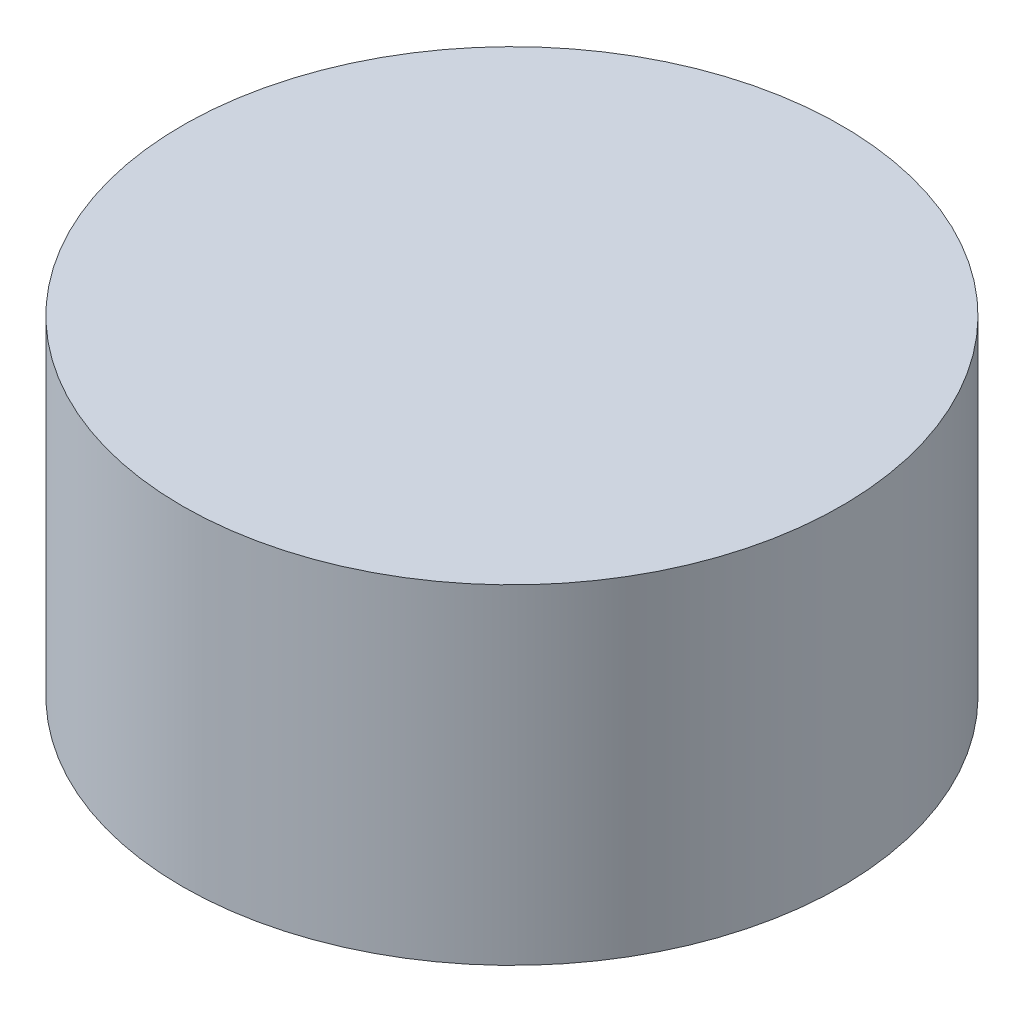
ISO-10303-21;
HEADER;
FILE_DESCRIPTION(('STEP AP214'),'2;1');
FILE_NAME('part.step','',(''),(''),'','','');
FILE_SCHEMA(('AUTOMOTIVE_DESIGN { 1 0 10303 214 1 1 1 1 }'));
ENDSEC;
DATA;
#1=APPLICATION_CONTEXT('core data for automotive mechanical design processes');
#2=APPLICATION_PROTOCOL_DEFINITION('international standard','automotive_design',2000,#1);
#3=PRODUCT_CONTEXT('',#1,'mechanical');
#4=PRODUCT('Part','Part','',(#3));
#5=PRODUCT_RELATED_PRODUCT_CATEGORY('part','',(#4));
#6=PRODUCT_DEFINITION_FORMATION('','',#4);
#7=PRODUCT_DEFINITION_CONTEXT('part definition',#1,'design');
#8=PRODUCT_DEFINITION('design','',#6,#7);
#9=PRODUCT_DEFINITION_SHAPE('','',#8);
#10=(LENGTH_UNIT() NAMED_UNIT(*) SI_UNIT(.MILLI.,.METRE.));
#11=(NAMED_UNIT(*) PLANE_ANGLE_UNIT() SI_UNIT($,.RADIAN.));
#12=(NAMED_UNIT(*) SI_UNIT($,.STERADIAN.) SOLID_ANGLE_UNIT());
#13=UNCERTAINTY_MEASURE_WITH_UNIT(LENGTH_MEASURE(1.E-05),#10,'distance_accuracy_value','');
#14=(GEOMETRIC_REPRESENTATION_CONTEXT(3) GLOBAL_UNCERTAINTY_ASSIGNED_CONTEXT((#13)) GLOBAL_UNIT_ASSIGNED_CONTEXT((#10,
#11,#12)) REPRESENTATION_CONTEXT('',''));
#15=CARTESIAN_POINT('',(0.,0.,0.));
#16=DIRECTION('',(0.,0.,1.));
#17=DIRECTION('',(1.,0.,0.));
#18=AXIS2_PLACEMENT_3D('',#15,#16,#17);
#19=CARTESIAN_POINT('',(0.,0.,0.));
#20=DIRECTION('',(0.,1.,0.));
#21=DIRECTION('',(0.,0.,1.));
#22=AXIS2_PLACEMENT_3D('',#19,#20,#21);
#23=PLANE('',#22);
#24=DIRECTION('',(1.,0.,0.));
#25=VECTOR('',#24,1.);
#26=CARTESIAN_POINT('',(0.,0.,3.7));
#27=LINE('',#26,#25);
#28=CARTESIAN_POINT('',(10.,0.,3.7));
#29=VERTEX_POINT('',#28);
#30=CARTESIAN_POINT('',(12.7,0.,3.7));
#31=VERTEX_POINT('',#30);
#32=EDGE_CURVE('E68',#29,#31,#27,.T.);
#33=ORIENTED_EDGE('',*,*,#32,.T.);
#34=DIRECTION('',(0.,0.,-1.));
#35=VECTOR('',#34,1.);
#36=CARTESIAN_POINT('',(12.7,0.,0.));
#37=LINE('',#36,#35);
#38=CARTESIAN_POINT('',(12.7,0.,-3.7));
#39=VERTEX_POINT('',#38);
#40=EDGE_CURVE('E154',#31,#39,#37,.T.);
#41=ORIENTED_EDGE('',*,*,#40,.T.);
#42=DIRECTION('',(1.,0.,0.));
#43=VECTOR('',#42,1.);
#44=CARTESIAN_POINT('',(0.,0.,-3.70000000000001));
#45=LINE('',#44,#43);
#46=CARTESIAN_POINT('',(10.,0.,-3.7));
#47=VERTEX_POINT('',#46);
#48=EDGE_CURVE('E167',#47,#39,#45,.T.);
#49=ORIENTED_EDGE('',*,*,#48,.F.);
#50=DIRECTION('',(0.,0.,-1.));
#51=VECTOR('',#50,1.);
#52=CARTESIAN_POINT('',(10.,0.,0.));
#53=LINE('',#52,#51);
#54=EDGE_CURVE('E164',#29,#47,#53,.T.);
#55=ORIENTED_EDGE('',*,*,#54,.F.);
#56=EDGE_LOOP('',(#33,#41,#49,#55));
#57=FACE_BOUND('',#56,.T.);
#58=CARTESIAN_POINT('',(0.,0.,0.));
#59=DIRECTION('',(0.,1.,0.));
#60=DIRECTION('',(0.,0.,1.));
#61=AXIS2_PLACEMENT_3D('',#58,#59,#60);
#62=CIRCLE('',#61,15.);
#63=CARTESIAN_POINT('',(0.,0.,15.));
#64=VERTEX_POINT('',#63);
#65=EDGE_CURVE('E49',#64,#64,#62,.T.);
#66=ORIENTED_EDGE('',*,*,#65,.F.);
#67=EDGE_LOOP('',(#66));
#68=FACE_BOUND('',#67,.T.);
#69=DIRECTION('',(0.,0.,-1.));
#70=VECTOR('',#69,1.);
#71=CARTESIAN_POINT('',(-10.,0.,0.));
#72=LINE('',#71,#70);
#73=CARTESIAN_POINT('',(-10.,0.,3.7));
#74=VERTEX_POINT('',#73);
#75=CARTESIAN_POINT('',(-10.,0.,-3.7));
#76=VERTEX_POINT('',#75);
#77=EDGE_CURVE('E60',#74,#76,#72,.T.);
#78=ORIENTED_EDGE('',*,*,#77,.T.);
#79=DIRECTION('',(-1.,0.,0.));
#80=VECTOR('',#79,1.);
#81=CARTESIAN_POINT('',(0.,0.,-3.70000000000001));
#82=LINE('',#81,#80);
#83=CARTESIAN_POINT('',(-12.7,0.,-3.7));
#84=VERTEX_POINT('',#83);
#85=EDGE_CURVE('E127',#76,#84,#82,.T.);
#86=ORIENTED_EDGE('',*,*,#85,.T.);
#87=DIRECTION('',(0.,0.,-1.));
#88=VECTOR('',#87,1.);
#89=CARTESIAN_POINT('',(-12.7,0.,0.));
#90=LINE('',#89,#88);
#91=CARTESIAN_POINT('',(-12.7,0.,3.7));
#92=VERTEX_POINT('',#91);
#93=EDGE_CURVE('E140',#92,#84,#90,.T.);
#94=ORIENTED_EDGE('',*,*,#93,.F.);
#95=DIRECTION('',(-1.,0.,0.));
#96=VECTOR('',#95,1.);
#97=CARTESIAN_POINT('',(0.,0.,3.7));
#98=LINE('',#97,#96);
#99=EDGE_CURVE('E137',#74,#92,#98,.T.);
#100=ORIENTED_EDGE('',*,*,#99,.F.);
#101=EDGE_LOOP('',(#78,#86,#94,#100));
#102=FACE_BOUND('',#101,.T.);
#103=ADVANCED_FACE('F45',(#57,#68,#102),#23,.F.);
#104=CARTESIAN_POINT('',(0.,15.,0.));
#105=DIRECTION('',(0.,-1.,0.));
#106=DIRECTION('',(0.,0.,-1.));
#107=AXIS2_PLACEMENT_3D('',#104,#105,#106);
#108=CYLINDRICAL_SURFACE('',#107,15.);
#109=CARTESIAN_POINT('',(0.,15.,0.));
#110=DIRECTION('',(0.,1.,0.));
#111=DIRECTION('',(0.,0.,1.));
#112=AXIS2_PLACEMENT_3D('',#109,#110,#111);
#113=CIRCLE('',#112,15.);
#114=CARTESIAN_POINT('',(0.,15.,15.));
#115=VERTEX_POINT('',#114);
#116=EDGE_CURVE('E12',#115,#115,#113,.T.);
#117=ORIENTED_EDGE('',*,*,#116,.F.);
#118=EDGE_LOOP('',(#117));
#119=FACE_BOUND('',#118,.T.);
#120=ORIENTED_EDGE('',*,*,#65,.T.);
#121=EDGE_LOOP('',(#120));
#122=FACE_BOUND('',#121,.T.);
#123=ADVANCED_FACE('F47',(#119,#122),#108,.T.);
#124=CARTESIAN_POINT('',(0.,15.,0.));
#125=DIRECTION('',(0.,1.,0.));
#126=DIRECTION('',(0.,0.,1.));
#127=AXIS2_PLACEMENT_3D('',#124,#125,#126);
#128=PLANE('',#127);
#129=ORIENTED_EDGE('',*,*,#116,.T.);
#130=EDGE_LOOP('',(#129));
#131=FACE_BOUND('',#130,.T.);
#132=ADVANCED_FACE('F202',(#131),#128,.T.);
#133=CARTESIAN_POINT('',(0.,5.,3.7));
#134=DIRECTION('',(0.,0.,-1.));
#135=DIRECTION('',(-1.,0.,0.));
#136=AXIS2_PLACEMENT_3D('',#133,#134,#135);
#137=PLANE('',#136);
#138=ORIENTED_EDGE('',*,*,#32,.F.);
#139=DIRECTION('',(0.,-1.,0.));
#140=VECTOR('',#139,1.);
#141=CARTESIAN_POINT('',(10.,5.,3.7));
#142=LINE('',#141,#140);
#143=CARTESIAN_POINT('',(10.,5.,3.7));
#144=VERTEX_POINT('',#143);
#145=EDGE_CURVE('E162',#144,#29,#142,.T.);
#146=ORIENTED_EDGE('',*,*,#145,.F.);
#147=DIRECTION('',(1.,0.,0.));
#148=VECTOR('',#147,1.);
#149=CARTESIAN_POINT('',(0.,5.,3.7));
#150=LINE('',#149,#148);
#151=CARTESIAN_POINT('',(12.7,5.,3.7));
#152=VERTEX_POINT('',#151);
#153=EDGE_CURVE('E150',#144,#152,#150,.T.);
#154=ORIENTED_EDGE('',*,*,#153,.T.);
#155=DIRECTION('',(0.,-1.,0.));
#156=VECTOR('',#155,1.);
#157=CARTESIAN_POINT('',(12.7,5.,3.7));
#158=LINE('',#157,#156);
#159=EDGE_CURVE('E138',#152,#31,#158,.T.);
#160=ORIENTED_EDGE('',*,*,#159,.T.);
#161=EDGE_LOOP('',(#138,#146,#154,#160));
#162=FACE_BOUND('',#161,.T.);
#163=ADVANCED_FACE('F192',(#162),#137,.T.);
#164=CARTESIAN_POINT('',(12.7,5.,0.));
#165=DIRECTION('',(-1.,0.,0.));
#166=DIRECTION('',(0.,0.,1.));
#167=AXIS2_PLACEMENT_3D('',#164,#165,#166);
#168=PLANE('',#167);
#169=ORIENTED_EDGE('',*,*,#40,.F.);
#170=ORIENTED_EDGE('',*,*,#159,.F.);
#171=DIRECTION('',(0.,0.,-1.));
#172=VECTOR('',#171,1.);
#173=CARTESIAN_POINT('',(12.7,5.,0.));
#174=LINE('',#173,#172);
#175=CARTESIAN_POINT('',(12.7,5.,-3.7));
#176=VERTEX_POINT('',#175);
#177=EDGE_CURVE('E160',#152,#176,#174,.T.);
#178=ORIENTED_EDGE('',*,*,#177,.T.);
#179=DIRECTION('',(0.,-1.,0.));
#180=VECTOR('',#179,1.);
#181=CARTESIAN_POINT('',(12.7,5.,-3.7));
#182=LINE('',#181,#180);
#183=EDGE_CURVE('E173',#176,#39,#182,.T.);
#184=ORIENTED_EDGE('',*,*,#183,.T.);
#185=EDGE_LOOP('',(#169,#170,#178,#184));
#186=FACE_BOUND('',#185,.T.);
#187=ADVANCED_FACE('F194',(#186),#168,.T.);
#188=CARTESIAN_POINT('',(0.,5.,-3.70000000000001));
#189=DIRECTION('',(0.,0.,-1.));
#190=DIRECTION('',(-1.,0.,0.));
#191=AXIS2_PLACEMENT_3D('',#188,#189,#190);
#192=PLANE('',#191);
#193=ORIENTED_EDGE('',*,*,#48,.T.);
#194=ORIENTED_EDGE('',*,*,#183,.F.);
#195=DIRECTION('',(1.,0.,0.));
#196=VECTOR('',#195,1.);
#197=CARTESIAN_POINT('',(0.,5.,-3.70000000000001));
#198=LINE('',#197,#196);
#199=CARTESIAN_POINT('',(10.,5.,-3.7));
#200=VERTEX_POINT('',#199);
#201=EDGE_CURVE('E157',#200,#176,#198,.T.);
#202=ORIENTED_EDGE('',*,*,#201,.F.);
#203=DIRECTION('',(0.,-1.,0.));
#204=VECTOR('',#203,1.);
#205=CARTESIAN_POINT('',(10.,5.,-3.7));
#206=LINE('',#205,#204);
#207=EDGE_CURVE('E175',#200,#47,#206,.T.);
#208=ORIENTED_EDGE('',*,*,#207,.T.);
#209=EDGE_LOOP('',(#193,#194,#202,#208));
#210=FACE_BOUND('',#209,.T.);
#211=ADVANCED_FACE('F187',(#210),#192,.F.);
#212=CARTESIAN_POINT('',(10.,5.,0.));
#213=DIRECTION('',(-1.,0.,0.));
#214=DIRECTION('',(0.,0.,1.));
#215=AXIS2_PLACEMENT_3D('',#212,#213,#214);
#216=PLANE('',#215);
#217=ORIENTED_EDGE('',*,*,#54,.T.);
#218=ORIENTED_EDGE('',*,*,#207,.F.);
#219=DIRECTION('',(0.,0.,-1.));
#220=VECTOR('',#219,1.);
#221=CARTESIAN_POINT('',(10.,5.,0.));
#222=LINE('',#221,#220);
#223=EDGE_CURVE('E153',#144,#200,#222,.T.);
#224=ORIENTED_EDGE('',*,*,#223,.F.);
#225=ORIENTED_EDGE('',*,*,#145,.T.);
#226=EDGE_LOOP('',(#217,#218,#224,#225));
#227=FACE_BOUND('',#226,.T.);
#228=ADVANCED_FACE('F180',(#227),#216,.F.);
#229=CARTESIAN_POINT('',(0.,5.,0.));
#230=DIRECTION('',(0.,-1.,0.));
#231=DIRECTION('',(0.,0.,-1.));
#232=AXIS2_PLACEMENT_3D('',#229,#230,#231);
#233=PLANE('',#232);
#234=ORIENTED_EDGE('',*,*,#153,.F.);
#235=ORIENTED_EDGE('',*,*,#223,.T.);
#236=ORIENTED_EDGE('',*,*,#201,.T.);
#237=ORIENTED_EDGE('',*,*,#177,.F.);
#238=EDGE_LOOP('',(#234,#235,#236,#237));
#239=FACE_BOUND('',#238,.T.);
#240=ADVANCED_FACE('F190',(#239),#233,.T.);
#241=CARTESIAN_POINT('',(-10.,5.,0.));
#242=DIRECTION('',(-1.,0.,0.));
#243=DIRECTION('',(0.,0.,1.));
#244=AXIS2_PLACEMENT_3D('',#241,#242,#243);
#245=PLANE('',#244);
#246=ORIENTED_EDGE('',*,*,#77,.F.);
#247=DIRECTION('',(0.,-1.,0.));
#248=VECTOR('',#247,1.);
#249=CARTESIAN_POINT('',(-10.,5.,3.7));
#250=LINE('',#249,#248);
#251=CARTESIAN_POINT('',(-10.,5.,3.7));
#252=VERTEX_POINT('',#251);
#253=EDGE_CURVE('E110',#252,#74,#250,.T.);
#254=ORIENTED_EDGE('',*,*,#253,.F.);
#255=DIRECTION('',(0.,0.,-1.));
#256=VECTOR('',#255,1.);
#257=CARTESIAN_POINT('',(-10.,5.,0.));
#258=LINE('',#257,#256);
#259=CARTESIAN_POINT('',(-10.,5.,-3.7));
#260=VERTEX_POINT('',#259);
#261=EDGE_CURVE('E113',#252,#260,#258,.T.);
#262=ORIENTED_EDGE('',*,*,#261,.T.);
#263=DIRECTION('',(0.,-1.,0.));
#264=VECTOR('',#263,1.);
#265=CARTESIAN_POINT('',(-10.,5.,-3.7));
#266=LINE('',#265,#264);
#267=EDGE_CURVE('E145',#260,#76,#266,.T.);
#268=ORIENTED_EDGE('',*,*,#267,.T.);
#269=EDGE_LOOP('',(#246,#254,#262,#268));
#270=FACE_BOUND('',#269,.T.);
#271=ADVANCED_FACE('F112',(#270),#245,.T.);
#272=CARTESIAN_POINT('',(0.,5.,-3.70000000000001));
#273=DIRECTION('',(0.,0.,1.));
#274=DIRECTION('',(1.,0.,0.));
#275=AXIS2_PLACEMENT_3D('',#272,#273,#274);
#276=PLANE('',#275);
#277=ORIENTED_EDGE('',*,*,#85,.F.);
#278=ORIENTED_EDGE('',*,*,#267,.F.);
#279=DIRECTION('',(-1.,0.,0.));
#280=VECTOR('',#279,1.);
#281=CARTESIAN_POINT('',(0.,5.,-3.70000000000001));
#282=LINE('',#281,#280);
#283=CARTESIAN_POINT('',(-12.7,5.,-3.7));
#284=VERTEX_POINT('',#283);
#285=EDGE_CURVE('E120',#260,#284,#282,.T.);
#286=ORIENTED_EDGE('',*,*,#285,.T.);
#287=DIRECTION('',(0.,-1.,0.));
#288=VECTOR('',#287,1.);
#289=CARTESIAN_POINT('',(-12.7,5.,-3.7));
#290=LINE('',#289,#288);
#291=EDGE_CURVE('E147',#284,#84,#290,.T.);
#292=ORIENTED_EDGE('',*,*,#291,.T.);
#293=EDGE_LOOP('',(#277,#278,#286,#292));
#294=FACE_BOUND('',#293,.T.);
#295=ADVANCED_FACE('F221',(#294),#276,.T.);
#296=CARTESIAN_POINT('',(-12.7,5.,0.));
#297=DIRECTION('',(-1.,0.,0.));
#298=DIRECTION('',(0.,0.,1.));
#299=AXIS2_PLACEMENT_3D('',#296,#297,#298);
#300=PLANE('',#299);
#301=ORIENTED_EDGE('',*,*,#93,.T.);
#302=ORIENTED_EDGE('',*,*,#291,.F.);
#303=DIRECTION('',(0.,0.,-1.));
#304=VECTOR('',#303,1.);
#305=CARTESIAN_POINT('',(-12.7,5.,0.));
#306=LINE('',#305,#304);
#307=CARTESIAN_POINT('',(-12.7,5.,3.7));
#308=VERTEX_POINT('',#307);
#309=EDGE_CURVE('E131',#308,#284,#306,.T.);
#310=ORIENTED_EDGE('',*,*,#309,.F.);
#311=DIRECTION('',(0.,-1.,0.));
#312=VECTOR('',#311,1.);
#313=CARTESIAN_POINT('',(-12.7,5.,3.7));
#314=LINE('',#313,#312);
#315=EDGE_CURVE('E119',#308,#92,#314,.T.);
#316=ORIENTED_EDGE('',*,*,#315,.T.);
#317=EDGE_LOOP('',(#301,#302,#310,#316));
#318=FACE_BOUND('',#317,.T.);
#319=ADVANCED_FACE('F226',(#318),#300,.F.);
#320=CARTESIAN_POINT('',(0.,5.,3.7));
#321=DIRECTION('',(0.,0.,1.));
#322=DIRECTION('',(1.,0.,0.));
#323=AXIS2_PLACEMENT_3D('',#320,#321,#322);
#324=PLANE('',#323);
#325=ORIENTED_EDGE('',*,*,#99,.T.);
#326=ORIENTED_EDGE('',*,*,#315,.F.);
#327=DIRECTION('',(-1.,0.,0.));
#328=VECTOR('',#327,1.);
#329=CARTESIAN_POINT('',(0.,5.,3.7));
#330=LINE('',#329,#328);
#331=EDGE_CURVE('E126',#252,#308,#330,.T.);
#332=ORIENTED_EDGE('',*,*,#331,.F.);
#333=ORIENTED_EDGE('',*,*,#253,.T.);
#334=EDGE_LOOP('',(#325,#326,#332,#333));
#335=FACE_BOUND('',#334,.T.);
#336=ADVANCED_FACE('F129',(#335),#324,.F.);
#337=CARTESIAN_POINT('',(0.,5.,0.));
#338=DIRECTION('',(0.,-1.,0.));
#339=DIRECTION('',(0.,0.,-1.));
#340=AXIS2_PLACEMENT_3D('',#337,#338,#339);
#341=PLANE('',#340);
#342=ORIENTED_EDGE('',*,*,#261,.F.);
#343=ORIENTED_EDGE('',*,*,#331,.T.);
#344=ORIENTED_EDGE('',*,*,#309,.T.);
#345=ORIENTED_EDGE('',*,*,#285,.F.);
#346=EDGE_LOOP('',(#342,#343,#344,#345));
#347=FACE_BOUND('',#346,.T.);
#348=ADVANCED_FACE('F124',(#347),#341,.T.);
#349=CLOSED_SHELL('',(#103,#123,#132,#163,#187,#211,#228,#240,#271,#295,#319,#336,#348));
#350=MANIFOLD_SOLID_BREP('B2',#349);
#351=ADVANCED_BREP_SHAPE_REPRESENTATION('',(#18,#350),#14);
#352=SHAPE_DEFINITION_REPRESENTATION(#9,#351);
ENDSEC;
END-ISO-10303-21;
